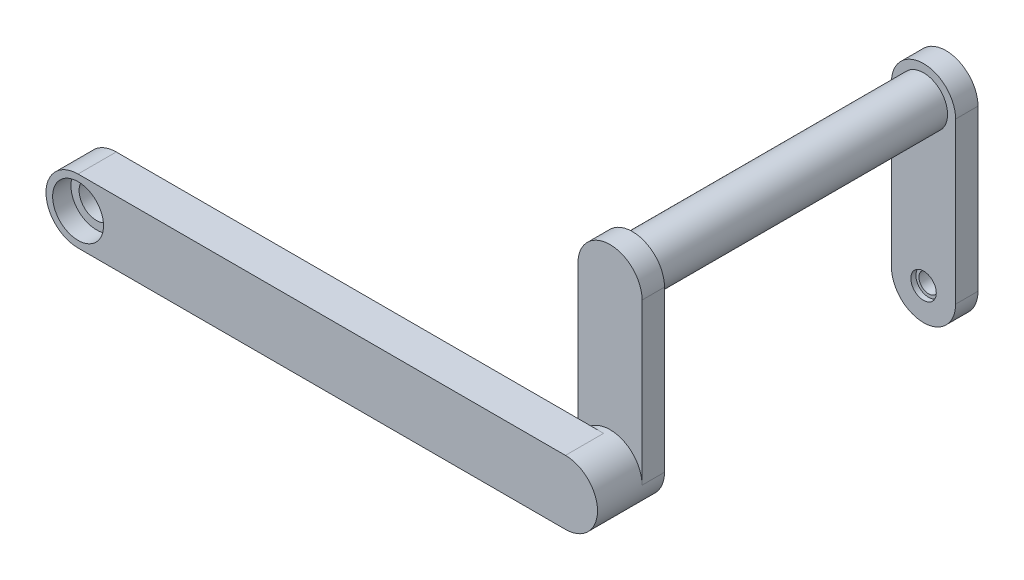
ISO-10303-21;
HEADER;
FILE_DESCRIPTION(('STEP AP214'),'2;1');
FILE_NAME('part.step','',(''),(''),'','','');
FILE_SCHEMA(('AUTOMOTIVE_DESIGN { 1 0 10303 214 1 1 1 1 }'));
ENDSEC;
DATA;
#1=APPLICATION_CONTEXT('core data for automotive mechanical design processes');
#2=APPLICATION_PROTOCOL_DEFINITION('international standard','automotive_design',2000,#1);
#3=PRODUCT_CONTEXT('',#1,'mechanical');
#4=PRODUCT('Part','Part','',(#3));
#5=PRODUCT_RELATED_PRODUCT_CATEGORY('part','',(#4));
#6=PRODUCT_DEFINITION_FORMATION('','',#4);
#7=PRODUCT_DEFINITION_CONTEXT('part definition',#1,'design');
#8=PRODUCT_DEFINITION('design','',#6,#7);
#9=PRODUCT_DEFINITION_SHAPE('','',#8);
#10=(LENGTH_UNIT() NAMED_UNIT(*) SI_UNIT(.MILLI.,.METRE.));
#11=(NAMED_UNIT(*) PLANE_ANGLE_UNIT() SI_UNIT($,.RADIAN.));
#12=(NAMED_UNIT(*) SI_UNIT($,.STERADIAN.) SOLID_ANGLE_UNIT());
#13=UNCERTAINTY_MEASURE_WITH_UNIT(LENGTH_MEASURE(1.E-05),#10,'distance_accuracy_value','');
#14=(GEOMETRIC_REPRESENTATION_CONTEXT(3) GLOBAL_UNCERTAINTY_ASSIGNED_CONTEXT((#13)) GLOBAL_UNIT_ASSIGNED_CONTEXT((#10,
#11,#12)) REPRESENTATION_CONTEXT('',''));
#15=CARTESIAN_POINT('',(0.,0.,0.));
#16=DIRECTION('',(0.,0.,1.));
#17=DIRECTION('',(1.,0.,0.));
#18=AXIS2_PLACEMENT_3D('',#15,#16,#17);
#19=CARTESIAN_POINT('',(47.88,0.,-33.63));
#20=DIRECTION('',(0.,0.,1.));
#21=DIRECTION('',(1.,0.,0.));
#22=AXIS2_PLACEMENT_3D('',#19,#20,#21);
#23=CYLINDRICAL_SURFACE('',#22,0.950000000000001);
#24=CARTESIAN_POINT('',(47.88,0.,-33.63));
#25=DIRECTION('',(0.,0.,-1.));
#26=DIRECTION('',(-1.,0.,0.));
#27=AXIS2_PLACEMENT_3D('',#24,#25,#26);
#28=CIRCLE('',#27,0.950000000000001);
#29=CARTESIAN_POINT('',(46.93,0.,-33.63));
#30=VERTEX_POINT('',#29);
#31=EDGE_CURVE('E462',#30,#30,#28,.T.);
#32=ORIENTED_EDGE('',*,*,#31,.T.);
#33=EDGE_LOOP('',(#32));
#34=FACE_BOUND('',#33,.T.);
#35=CARTESIAN_POINT('',(47.88,0.,-31.93));
#36=DIRECTION('',(0.,0.,1.));
#37=DIRECTION('',(1.,0.,0.));
#38=AXIS2_PLACEMENT_3D('',#35,#36,#37);
#39=CIRCLE('',#38,0.950000000000001);
#40=CARTESIAN_POINT('',(48.83,0.,-31.93));
#41=VERTEX_POINT('',#40);
#42=EDGE_CURVE('E45',#41,#41,#39,.T.);
#43=ORIENTED_EDGE('',*,*,#42,.T.);
#44=EDGE_LOOP('',(#43));
#45=FACE_BOUND('',#44,.T.);
#46=ADVANCED_FACE('F41',(#34,#45),#23,.F.);
#47=CARTESIAN_POINT('',(0.,0.,3.75));
#48=DIRECTION('',(0.,0.,-1.));
#49=DIRECTION('',(-1.,0.,0.));
#50=AXIS2_PLACEMENT_3D('',#47,#48,#49);
#51=CYLINDRICAL_SURFACE('',#50,1.7);
#52=CARTESIAN_POINT('',(0.,0.,0.));
#53=DIRECTION('',(0.,0.,1.));
#54=DIRECTION('',(1.,0.,0.));
#55=AXIS2_PLACEMENT_3D('',#52,#53,#54);
#56=CIRCLE('',#55,1.7);
#57=CARTESIAN_POINT('',(1.7,0.,0.));
#58=VERTEX_POINT('',#57);
#59=EDGE_CURVE('E213',#58,#58,#56,.T.);
#60=ORIENTED_EDGE('',*,*,#59,.F.);
#61=EDGE_LOOP('',(#60));
#62=FACE_BOUND('',#61,.T.);
#63=CARTESIAN_POINT('',(0.,0.,1.95));
#64=DIRECTION('',(0.,0.,1.));
#65=DIRECTION('',(1.,0.,0.));
#66=AXIS2_PLACEMENT_3D('',#63,#64,#65);
#67=CIRCLE('',#66,1.7);
#68=CARTESIAN_POINT('',(1.7,0.,1.95));
#69=VERTEX_POINT('',#68);
#70=EDGE_CURVE('E210',#69,#69,#67,.T.);
#71=ORIENTED_EDGE('',*,*,#70,.T.);
#72=EDGE_LOOP('',(#71));
#73=FACE_BOUND('',#72,.T.);
#74=ADVANCED_FACE('F240',(#62,#73),#51,.F.);
#75=CARTESIAN_POINT('',(0.,0.,3.75));
#76=DIRECTION('',(0.,0.,1.));
#77=DIRECTION('',(1.,0.,0.));
#78=AXIS2_PLACEMENT_3D('',#75,#76,#77);
#79=PLANE('',#78);
#80=CARTESIAN_POINT('',(0.,0.,3.75));
#81=DIRECTION('',(0.,0.,1.));
#82=DIRECTION('',(1.,0.,0.));
#83=AXIS2_PLACEMENT_3D('',#80,#81,#82);
#84=CIRCLE('',#83,2.5);
#85=CARTESIAN_POINT('',(2.5,0.,3.75));
#86=VERTEX_POINT('',#85);
#87=EDGE_CURVE('E206',#86,#86,#84,.T.);
#88=ORIENTED_EDGE('',*,*,#87,.F.);
#89=EDGE_LOOP('',(#88));
#90=FACE_BOUND('',#89,.T.);
#91=CARTESIAN_POINT('',(0.,0.,3.75));
#92=DIRECTION('',(0.,0.,1.));
#93=DIRECTION('',(1.,0.,0.));
#94=AXIS2_PLACEMENT_3D('',#91,#92,#93);
#95=CIRCLE('',#94,3.15);
#96=CARTESIAN_POINT('',(0.,3.15,3.75));
#97=VERTEX_POINT('',#96);
#98=CARTESIAN_POINT('',(0.,-3.15,3.75));
#99=VERTEX_POINT('',#98);
#100=EDGE_CURVE('E218',#97,#99,#95,.T.);
#101=ORIENTED_EDGE('',*,*,#100,.T.);
#102=DIRECTION('',(1.,0.,0.));
#103=VECTOR('',#102,1.);
#104=CARTESIAN_POINT('',(0.,-3.15,3.75));
#105=LINE('',#104,#103);
#106=CARTESIAN_POINT('',(47.88,-3.15,3.75));
#107=VERTEX_POINT('',#106);
#108=EDGE_CURVE('E93',#99,#107,#105,.T.);
#109=ORIENTED_EDGE('',*,*,#108,.T.);
#110=CARTESIAN_POINT('',(47.88,0.,3.75));
#111=DIRECTION('',(0.,0.,1.));
#112=DIRECTION('',(1.,0.,0.));
#113=AXIS2_PLACEMENT_3D('',#110,#111,#112);
#114=CIRCLE('',#113,3.15);
#115=CARTESIAN_POINT('',(47.88,3.15,3.75));
#116=VERTEX_POINT('',#115);
#117=EDGE_CURVE('E221',#107,#116,#114,.T.);
#118=ORIENTED_EDGE('',*,*,#117,.T.);
#119=DIRECTION('',(-1.,0.,0.));
#120=VECTOR('',#119,1.);
#121=CARTESIAN_POINT('',(0.,3.15,3.75));
#122=LINE('',#121,#120);
#123=EDGE_CURVE('E67',#116,#97,#122,.T.);
#124=ORIENTED_EDGE('',*,*,#123,.T.);
#125=EDGE_LOOP('',(#101,#109,#118,#124));
#126=FACE_BOUND('',#125,.T.);
#127=ADVANCED_FACE('F256',(#90,#126),#79,.T.);
#128=CARTESIAN_POINT('',(0.,0.,0.));
#129=DIRECTION('',(0.,0.,1.));
#130=DIRECTION('',(1.,0.,0.));
#131=AXIS2_PLACEMENT_3D('',#128,#129,#130);
#132=PLANE('',#131);
#133=CARTESIAN_POINT('',(47.88,0.,0.));
#134=DIRECTION('',(0.,0.,-1.));
#135=DIRECTION('',(-1.,0.,0.));
#136=AXIS2_PLACEMENT_3D('',#133,#134,#135);
#137=CIRCLE('',#136,3.15);
#138=CARTESIAN_POINT('',(47.88,-3.15,0.));
#139=VERTEX_POINT('',#138);
#140=CARTESIAN_POINT('',(47.88,3.15,0.));
#141=VERTEX_POINT('',#140);
#142=EDGE_CURVE('E11',#139,#141,#137,.T.);
#143=ORIENTED_EDGE('',*,*,#142,.F.);
#144=DIRECTION('',(1.,0.,0.));
#145=VECTOR('',#144,1.);
#146=CARTESIAN_POINT('',(0.,-3.15,0.));
#147=LINE('',#146,#145);
#148=CARTESIAN_POINT('',(0.,-3.15,0.));
#149=VERTEX_POINT('',#148);
#150=EDGE_CURVE('E227',#149,#139,#147,.T.);
#151=ORIENTED_EDGE('',*,*,#150,.F.);
#152=CARTESIAN_POINT('',(0.,0.,0.));
#153=DIRECTION('',(0.,0.,1.));
#154=DIRECTION('',(1.,0.,0.));
#155=AXIS2_PLACEMENT_3D('',#152,#153,#154);
#156=CIRCLE('',#155,3.15);
#157=CARTESIAN_POINT('',(0.,3.15,0.));
#158=VERTEX_POINT('',#157);
#159=EDGE_CURVE('E217',#158,#149,#156,.T.);
#160=ORIENTED_EDGE('',*,*,#159,.F.);
#161=DIRECTION('',(-1.,0.,0.));
#162=VECTOR('',#161,1.);
#163=CARTESIAN_POINT('',(0.,3.15,0.));
#164=LINE('',#163,#162);
#165=EDGE_CURVE('E85',#141,#158,#164,.T.);
#166=ORIENTED_EDGE('',*,*,#165,.F.);
#167=EDGE_LOOP('',(#143,#151,#160,#166));
#168=FACE_BOUND('',#167,.T.);
#169=ORIENTED_EDGE('',*,*,#59,.T.);
#170=EDGE_LOOP('',(#169));
#171=FACE_BOUND('',#170,.T.);
#172=ADVANCED_FACE('F258',(#168,#171),#132,.F.);
#173=CARTESIAN_POINT('',(0.,0.,3.75));
#174=DIRECTION('',(0.,0.,-1.));
#175=DIRECTION('',(-1.,0.,0.));
#176=AXIS2_PLACEMENT_3D('',#173,#174,#175);
#177=CYLINDRICAL_SURFACE('',#176,3.15);
#178=ORIENTED_EDGE('',*,*,#159,.T.);
#179=DIRECTION('',(0.,0.,-1.));
#180=VECTOR('',#179,1.);
#181=CARTESIAN_POINT('',(0.,-3.15,3.75));
#182=LINE('',#181,#180);
#183=EDGE_CURVE('E50',#99,#149,#182,.T.);
#184=ORIENTED_EDGE('',*,*,#183,.F.);
#185=ORIENTED_EDGE('',*,*,#100,.F.);
#186=DIRECTION('',(0.,0.,-1.));
#187=VECTOR('',#186,1.);
#188=CARTESIAN_POINT('',(0.,3.15,3.75));
#189=LINE('',#188,#187);
#190=EDGE_CURVE('E224',#97,#158,#189,.T.);
#191=ORIENTED_EDGE('',*,*,#190,.T.);
#192=EDGE_LOOP('',(#178,#184,#185,#191));
#193=FACE_BOUND('',#192,.T.);
#194=ADVANCED_FACE('F43',(#193),#177,.T.);
#195=CARTESIAN_POINT('',(0.,-3.15,3.75));
#196=DIRECTION('',(0.,1.,0.));
#197=DIRECTION('',(-1.,0.,0.));
#198=AXIS2_PLACEMENT_3D('',#195,#196,#197);
#199=PLANE('',#198);
#200=ORIENTED_EDGE('',*,*,#150,.T.);
#201=DIRECTION('',(0.,0.,-1.));
#202=VECTOR('',#201,1.);
#203=CARTESIAN_POINT('',(47.88,-3.15,3.75));
#204=LINE('',#203,#202);
#205=EDGE_CURVE('E234',#107,#139,#204,.T.);
#206=ORIENTED_EDGE('',*,*,#205,.F.);
#207=ORIENTED_EDGE('',*,*,#108,.F.);
#208=ORIENTED_EDGE('',*,*,#183,.T.);
#209=EDGE_LOOP('',(#200,#206,#207,#208));
#210=FACE_BOUND('',#209,.T.);
#211=ADVANCED_FACE('F264',(#210),#199,.F.);
#212=CARTESIAN_POINT('',(47.88,0.,3.75));
#213=DIRECTION('',(0.,0.,-1.));
#214=DIRECTION('',(-1.,0.,0.));
#215=AXIS2_PLACEMENT_3D('',#212,#213,#214);
#216=CYLINDRICAL_SURFACE('',#215,3.15);
#217=ORIENTED_EDGE('',*,*,#205,.T.);
#218=ORIENTED_EDGE('',*,*,#142,.T.);
#219=DIRECTION('',(0.,0.,-1.));
#220=VECTOR('',#219,1.);
#221=CARTESIAN_POINT('',(47.88,3.15,3.75));
#222=LINE('',#221,#220);
#223=EDGE_CURVE('E232',#116,#141,#222,.T.);
#224=ORIENTED_EDGE('',*,*,#223,.F.);
#225=ORIENTED_EDGE('',*,*,#117,.F.);
#226=EDGE_LOOP('',(#217,#218,#224,#225));
#227=FACE_BOUND('',#226,.T.);
#228=CARTESIAN_POINT('',(47.88,0.,-0.63));
#229=DIRECTION('',(0.,0.,-1.));
#230=DIRECTION('',(-1.,0.,0.));
#231=AXIS2_PLACEMENT_3D('',#228,#229,#230);
#232=CIRCLE('',#231,3.15);
#233=CARTESIAN_POINT('',(44.73,0.,-0.63));
#234=VERTEX_POINT('',#233);
#235=CARTESIAN_POINT('',(51.03,0.,-0.63));
#236=VERTEX_POINT('',#235);
#237=EDGE_CURVE('E58',#234,#236,#232,.T.);
#238=ORIENTED_EDGE('',*,*,#237,.F.);
#239=DIRECTION('',(0.,0.,1.));
#240=VECTOR('',#239,1.);
#241=CARTESIAN_POINT('',(44.73,0.,-2.83));
#242=LINE('',#241,#240);
#243=CARTESIAN_POINT('',(44.73,0.,-2.83));
#244=VERTEX_POINT('',#243);
#245=EDGE_CURVE('E197',#244,#234,#242,.T.);
#246=ORIENTED_EDGE('',*,*,#245,.F.);
#247=CARTESIAN_POINT('',(47.88,0.,-2.83));
#248=DIRECTION('',(0.,0.,-1.));
#249=DIRECTION('',(-1.,0.,0.));
#250=AXIS2_PLACEMENT_3D('',#247,#248,#249);
#251=CIRCLE('',#250,3.15);
#252=CARTESIAN_POINT('',(51.03,0.,-2.83));
#253=VERTEX_POINT('',#252);
#254=EDGE_CURVE('E185',#253,#244,#251,.T.);
#255=ORIENTED_EDGE('',*,*,#254,.F.);
#256=DIRECTION('',(0.,0.,1.));
#257=VECTOR('',#256,1.);
#258=CARTESIAN_POINT('',(51.03,0.,-2.83));
#259=LINE('',#258,#257);
#260=EDGE_CURVE('E200',#253,#236,#259,.T.);
#261=ORIENTED_EDGE('',*,*,#260,.T.);
#262=EDGE_LOOP('',(#238,#246,#255,#261));
#263=FACE_BOUND('',#262,.T.);
#264=ADVANCED_FACE('F268',(#227,#263),#216,.T.);
#265=CARTESIAN_POINT('',(0.,3.15,3.75));
#266=DIRECTION('',(0.,-1.,0.));
#267=DIRECTION('',(1.,0.,0.));
#268=AXIS2_PLACEMENT_3D('',#265,#266,#267);
#269=PLANE('',#268);
#270=ORIENTED_EDGE('',*,*,#165,.T.);
#271=ORIENTED_EDGE('',*,*,#190,.F.);
#272=ORIENTED_EDGE('',*,*,#123,.F.);
#273=ORIENTED_EDGE('',*,*,#223,.T.);
#274=EDGE_LOOP('',(#270,#271,#272,#273));
#275=FACE_BOUND('',#274,.T.);
#276=ADVANCED_FACE('F252',(#275),#269,.F.);
#277=CARTESIAN_POINT('',(0.,0.,1.95));
#278=DIRECTION('',(0.,0.,1.));
#279=DIRECTION('',(1.,0.,0.));
#280=AXIS2_PLACEMENT_3D('',#277,#278,#279);
#281=CYLINDRICAL_SURFACE('',#280,2.5);
#282=CARTESIAN_POINT('',(0.,0.,1.95));
#283=DIRECTION('',(0.,0.,1.));
#284=DIRECTION('',(1.,0.,0.));
#285=AXIS2_PLACEMENT_3D('',#282,#283,#284);
#286=CIRCLE('',#285,2.5);
#287=CARTESIAN_POINT('',(2.5,0.,1.95));
#288=VERTEX_POINT('',#287);
#289=EDGE_CURVE('E207',#288,#288,#286,.T.);
#290=ORIENTED_EDGE('',*,*,#289,.F.);
#291=EDGE_LOOP('',(#290));
#292=FACE_BOUND('',#291,.T.);
#293=ORIENTED_EDGE('',*,*,#87,.T.);
#294=EDGE_LOOP('',(#293));
#295=FACE_BOUND('',#294,.T.);
#296=ADVANCED_FACE('F246',(#292,#295),#281,.F.);
#297=CARTESIAN_POINT('',(0.,0.,1.95));
#298=DIRECTION('',(0.,0.,1.));
#299=DIRECTION('',(1.,0.,0.));
#300=AXIS2_PLACEMENT_3D('',#297,#298,#299);
#301=PLANE('',#300);
#302=ORIENTED_EDGE('',*,*,#70,.F.);
#303=EDGE_LOOP('',(#302));
#304=FACE_BOUND('',#303,.T.);
#305=ORIENTED_EDGE('',*,*,#289,.T.);
#306=EDGE_LOOP('',(#305));
#307=FACE_BOUND('',#306,.T.);
#308=ADVANCED_FACE('F242',(#304,#307),#301,.T.);
#309=CARTESIAN_POINT('',(47.88,15.75,-0.63));
#310=DIRECTION('',(0.,0.,-1.));
#311=DIRECTION('',(-1.,0.,0.));
#312=AXIS2_PLACEMENT_3D('',#309,#310,#311);
#313=PLANE('',#312);
#314=DIRECTION('',(0.,1.,0.));
#315=VECTOR('',#314,1.);
#316=CARTESIAN_POINT('',(44.73,15.75,-0.63));
#317=LINE('',#316,#315);
#318=CARTESIAN_POINT('',(44.73,15.75,-0.63));
#319=VERTEX_POINT('',#318);
#320=EDGE_CURVE('E183',#234,#319,#317,.T.);
#321=ORIENTED_EDGE('',*,*,#320,.F.);
#322=ORIENTED_EDGE('',*,*,#237,.T.);
#323=DIRECTION('',(0.,-1.,0.));
#324=VECTOR('',#323,1.);
#325=CARTESIAN_POINT('',(51.03,15.75,-0.63));
#326=LINE('',#325,#324);
#327=CARTESIAN_POINT('',(51.03,15.75,-0.63));
#328=VERTEX_POINT('',#327);
#329=EDGE_CURVE('E192',#328,#236,#326,.T.);
#330=ORIENTED_EDGE('',*,*,#329,.F.);
#331=CARTESIAN_POINT('',(47.88,15.75,-0.63));
#332=DIRECTION('',(0.,0.,-1.));
#333=DIRECTION('',(-1.,0.,0.));
#334=AXIS2_PLACEMENT_3D('',#331,#332,#333);
#335=CIRCLE('',#334,3.15);
#336=EDGE_CURVE('E177',#319,#328,#335,.T.);
#337=ORIENTED_EDGE('',*,*,#336,.F.);
#338=EDGE_LOOP('',(#321,#322,#330,#337));
#339=FACE_BOUND('',#338,.T.);
#340=ADVANCED_FACE('F245',(#339),#313,.F.);
#341=CARTESIAN_POINT('',(47.88,15.75,-2.83));
#342=DIRECTION('',(0.,0.,1.));
#343=DIRECTION('',(1.,0.,0.));
#344=AXIS2_PLACEMENT_3D('',#341,#342,#343);
#345=CYLINDRICAL_SURFACE('',#344,3.15);
#346=ORIENTED_EDGE('',*,*,#336,.T.);
#347=DIRECTION('',(0.,0.,1.));
#348=VECTOR('',#347,1.);
#349=CARTESIAN_POINT('',(51.03,15.75,-2.83));
#350=LINE('',#349,#348);
#351=CARTESIAN_POINT('',(51.03,15.75,-2.83));
#352=VERTEX_POINT('',#351);
#353=EDGE_CURVE('E203',#352,#328,#350,.T.);
#354=ORIENTED_EDGE('',*,*,#353,.F.);
#355=CARTESIAN_POINT('',(47.88,15.75,-2.83));
#356=DIRECTION('',(0.,0.,-1.));
#357=DIRECTION('',(-1.,0.,0.));
#358=AXIS2_PLACEMENT_3D('',#355,#356,#357);
#359=CIRCLE('',#358,3.15);
#360=CARTESIAN_POINT('',(44.73,15.75,-2.83));
#361=VERTEX_POINT('',#360);
#362=EDGE_CURVE('E179',#361,#352,#359,.T.);
#363=ORIENTED_EDGE('',*,*,#362,.F.);
#364=DIRECTION('',(0.,0.,1.));
#365=VECTOR('',#364,1.);
#366=CARTESIAN_POINT('',(44.73,15.75,-2.83));
#367=LINE('',#366,#365);
#368=EDGE_CURVE('E189',#361,#319,#367,.T.);
#369=ORIENTED_EDGE('',*,*,#368,.T.);
#370=EDGE_LOOP('',(#346,#354,#363,#369));
#371=FACE_BOUND('',#370,.T.);
#372=ADVANCED_FACE('F334',(#371),#345,.T.);
#373=CARTESIAN_POINT('',(51.03,15.75,-2.83));
#374=DIRECTION('',(-1.,0.,0.));
#375=DIRECTION('',(0.,0.,1.));
#376=AXIS2_PLACEMENT_3D('',#373,#374,#375);
#377=PLANE('',#376);
#378=ORIENTED_EDGE('',*,*,#329,.T.);
#379=ORIENTED_EDGE('',*,*,#260,.F.);
#380=DIRECTION('',(0.,-1.,0.));
#381=VECTOR('',#380,1.);
#382=CARTESIAN_POINT('',(51.03,15.75,-2.83));
#383=LINE('',#382,#381);
#384=EDGE_CURVE('E182',#352,#253,#383,.T.);
#385=ORIENTED_EDGE('',*,*,#384,.F.);
#386=ORIENTED_EDGE('',*,*,#353,.T.);
#387=EDGE_LOOP('',(#378,#379,#385,#386));
#388=FACE_BOUND('',#387,.T.);
#389=ADVANCED_FACE('F342',(#388),#377,.F.);
#390=CARTESIAN_POINT('',(44.73,15.75,-2.83));
#391=DIRECTION('',(1.,0.,0.));
#392=DIRECTION('',(0.,0.,-1.));
#393=AXIS2_PLACEMENT_3D('',#390,#391,#392);
#394=PLANE('',#393);
#395=ORIENTED_EDGE('',*,*,#320,.T.);
#396=ORIENTED_EDGE('',*,*,#368,.F.);
#397=DIRECTION('',(0.,1.,0.));
#398=VECTOR('',#397,1.);
#399=CARTESIAN_POINT('',(44.73,15.75,-2.83));
#400=LINE('',#399,#398);
#401=EDGE_CURVE('E187',#244,#361,#400,.T.);
#402=ORIENTED_EDGE('',*,*,#401,.F.);
#403=ORIENTED_EDGE('',*,*,#245,.T.);
#404=EDGE_LOOP('',(#395,#396,#402,#403));
#405=FACE_BOUND('',#404,.T.);
#406=ADVANCED_FACE('F351',(#405),#394,.F.);
#407=CARTESIAN_POINT('',(47.88,15.75,-2.83));
#408=DIRECTION('',(0.,0.,-1.));
#409=DIRECTION('',(-1.,0.,0.));
#410=AXIS2_PLACEMENT_3D('',#407,#408,#409);
#411=PLANE('',#410);
#412=CARTESIAN_POINT('',(47.88,15.75,-2.83));
#413=DIRECTION('',(0.,0.,-1.));
#414=DIRECTION('',(-1.,0.,0.));
#415=AXIS2_PLACEMENT_3D('',#412,#413,#414);
#416=CIRCLE('',#415,2.3625);
#417=CARTESIAN_POINT('',(45.5175,15.75,-2.83));
#418=VERTEX_POINT('',#417);
#419=EDGE_CURVE('E167',#418,#418,#416,.T.);
#420=ORIENTED_EDGE('',*,*,#419,.F.);
#421=EDGE_LOOP('',(#420));
#422=FACE_BOUND('',#421,.T.);
#423=ORIENTED_EDGE('',*,*,#362,.T.);
#424=ORIENTED_EDGE('',*,*,#384,.T.);
#425=ORIENTED_EDGE('',*,*,#254,.T.);
#426=ORIENTED_EDGE('',*,*,#401,.T.);
#427=EDGE_LOOP('',(#423,#424,#425,#426));
#428=FACE_BOUND('',#427,.T.);
#429=ADVANCED_FACE('F360',(#422,#428),#411,.T.);
#430=CARTESIAN_POINT('',(47.88,15.75,-31.43));
#431=DIRECTION('',(0.,0.,1.));
#432=DIRECTION('',(1.,0.,0.));
#433=AXIS2_PLACEMENT_3D('',#430,#431,#432);
#434=CYLINDRICAL_SURFACE('',#433,2.3625);
#435=CARTESIAN_POINT('',(47.88,15.75,-31.43));
#436=DIRECTION('',(0.,0.,-1.));
#437=DIRECTION('',(-1.,0.,0.));
#438=AXIS2_PLACEMENT_3D('',#435,#436,#437);
#439=CIRCLE('',#438,2.3625);
#440=CARTESIAN_POINT('',(45.5175,15.75,-31.43));
#441=VERTEX_POINT('',#440);
#442=EDGE_CURVE('E170',#441,#441,#439,.T.);
#443=ORIENTED_EDGE('',*,*,#442,.F.);
#444=EDGE_LOOP('',(#443));
#445=FACE_BOUND('',#444,.T.);
#446=ORIENTED_EDGE('',*,*,#419,.T.);
#447=EDGE_LOOP('',(#446));
#448=FACE_BOUND('',#447,.T.);
#449=ADVANCED_FACE('F369',(#445,#448),#434,.T.);
#450=CARTESIAN_POINT('',(47.88,15.75,-33.63));
#451=DIRECTION('',(0.,0.,-1.));
#452=DIRECTION('',(-1.,0.,0.));
#453=AXIS2_PLACEMENT_3D('',#450,#451,#452);
#454=PLANE('',#453);
#455=CARTESIAN_POINT('',(47.88,15.75,-33.63));
#456=DIRECTION('',(0.,0.,-1.));
#457=DIRECTION('',(-1.,0.,0.));
#458=AXIS2_PLACEMENT_3D('',#455,#456,#457);
#459=CIRCLE('',#458,3.15);
#460=CARTESIAN_POINT('',(44.73,15.75,-33.63));
#461=VERTEX_POINT('',#460);
#462=CARTESIAN_POINT('',(51.03,15.75,-33.63));
#463=VERTEX_POINT('',#462);
#464=EDGE_CURVE('E152',#461,#463,#459,.T.);
#465=ORIENTED_EDGE('',*,*,#464,.T.);
#466=DIRECTION('',(0.,-1.,0.));
#467=VECTOR('',#466,1.);
#468=CARTESIAN_POINT('',(51.03,15.75,-33.63));
#469=LINE('',#468,#467);
#470=CARTESIAN_POINT('',(51.03,0.,-33.63));
#471=VERTEX_POINT('',#470);
#472=EDGE_CURVE('E141',#463,#471,#469,.T.);
#473=ORIENTED_EDGE('',*,*,#472,.T.);
#474=CARTESIAN_POINT('',(47.88,0.,-33.63));
#475=DIRECTION('',(0.,0.,-1.));
#476=DIRECTION('',(-1.,0.,0.));
#477=AXIS2_PLACEMENT_3D('',#474,#475,#476);
#478=CIRCLE('',#477,3.15);
#479=CARTESIAN_POINT('',(44.73,0.,-33.63));
#480=VERTEX_POINT('',#479);
#481=EDGE_CURVE('E151',#471,#480,#478,.T.);
#482=ORIENTED_EDGE('',*,*,#481,.T.);
#483=DIRECTION('',(0.,1.,0.));
#484=VECTOR('',#483,1.);
#485=CARTESIAN_POINT('',(44.73,15.75,-33.63));
#486=LINE('',#485,#484);
#487=EDGE_CURVE('E158',#480,#461,#486,.T.);
#488=ORIENTED_EDGE('',*,*,#487,.T.);
#489=EDGE_LOOP('',(#465,#473,#482,#488));
#490=FACE_BOUND('',#489,.T.);
#491=ORIENTED_EDGE('',*,*,#31,.F.);
#492=EDGE_LOOP('',(#491));
#493=FACE_BOUND('',#492,.T.);
#494=ADVANCED_FACE('F155',(#490,#493),#454,.T.);
#495=CARTESIAN_POINT('',(47.88,15.75,-31.43));
#496=DIRECTION('',(0.,0.,-1.));
#497=DIRECTION('',(-1.,0.,0.));
#498=AXIS2_PLACEMENT_3D('',#495,#496,#497);
#499=PLANE('',#498);
#500=CARTESIAN_POINT('',(47.88,0.,-31.43));
#501=DIRECTION('',(0.,0.,1.));
#502=DIRECTION('',(1.,0.,0.));
#503=AXIS2_PLACEMENT_3D('',#500,#501,#502);
#504=CIRCLE('',#503,1.25);
#505=CARTESIAN_POINT('',(49.13,0.,-31.43));
#506=VERTEX_POINT('',#505);
#507=EDGE_CURVE('E460',#506,#506,#504,.T.);
#508=ORIENTED_EDGE('',*,*,#507,.F.);
#509=EDGE_LOOP('',(#508));
#510=FACE_BOUND('',#509,.T.);
#511=ORIENTED_EDGE('',*,*,#442,.T.);
#512=EDGE_LOOP('',(#511));
#513=FACE_BOUND('',#512,.T.);
#514=CARTESIAN_POINT('',(47.88,15.75,-31.43));
#515=DIRECTION('',(0.,0.,-1.));
#516=DIRECTION('',(-1.,0.,0.));
#517=AXIS2_PLACEMENT_3D('',#514,#515,#516);
#518=CIRCLE('',#517,3.15);
#519=CARTESIAN_POINT('',(44.73,15.75,-31.43));
#520=VERTEX_POINT('',#519);
#521=CARTESIAN_POINT('',(51.03,15.75,-31.43));
#522=VERTEX_POINT('',#521);
#523=EDGE_CURVE('E166',#520,#522,#518,.T.);
#524=ORIENTED_EDGE('',*,*,#523,.F.);
#525=DIRECTION('',(0.,1.,0.));
#526=VECTOR('',#525,1.);
#527=CARTESIAN_POINT('',(44.73,15.75,-31.43));
#528=LINE('',#527,#526);
#529=CARTESIAN_POINT('',(44.73,0.,-31.43));
#530=VERTEX_POINT('',#529);
#531=EDGE_CURVE('E162',#530,#520,#528,.T.);
#532=ORIENTED_EDGE('',*,*,#531,.F.);
#533=CARTESIAN_POINT('',(47.88,0.,-31.43));
#534=DIRECTION('',(0.,0.,-1.));
#535=DIRECTION('',(-1.,0.,0.));
#536=AXIS2_PLACEMENT_3D('',#533,#534,#535);
#537=CIRCLE('',#536,3.15);
#538=CARTESIAN_POINT('',(51.03,0.,-31.43));
#539=VERTEX_POINT('',#538);
#540=EDGE_CURVE('E474',#539,#530,#537,.T.);
#541=ORIENTED_EDGE('',*,*,#540,.F.);
#542=DIRECTION('',(0.,-1.,0.));
#543=VECTOR('',#542,1.);
#544=CARTESIAN_POINT('',(51.03,15.75,-31.43));
#545=LINE('',#544,#543);
#546=EDGE_CURVE('E472',#522,#539,#545,.T.);
#547=ORIENTED_EDGE('',*,*,#546,.F.);
#548=EDGE_LOOP('',(#524,#532,#541,#547));
#549=FACE_BOUND('',#548,.T.);
#550=ADVANCED_FACE('F386',(#510,#513,#549),#499,.F.);
#551=CARTESIAN_POINT('',(47.88,15.75,-33.63));
#552=DIRECTION('',(0.,0.,1.));
#553=DIRECTION('',(1.,0.,0.));
#554=AXIS2_PLACEMENT_3D('',#551,#552,#553);
#555=CYLINDRICAL_SURFACE('',#554,3.15);
#556=ORIENTED_EDGE('',*,*,#523,.T.);
#557=DIRECTION('',(0.,0.,1.));
#558=VECTOR('',#557,1.);
#559=CARTESIAN_POINT('',(51.03,15.75,-33.63));
#560=LINE('',#559,#558);
#561=EDGE_CURVE('E145',#463,#522,#560,.T.);
#562=ORIENTED_EDGE('',*,*,#561,.F.);
#563=ORIENTED_EDGE('',*,*,#464,.F.);
#564=DIRECTION('',(0.,0.,1.));
#565=VECTOR('',#564,1.);
#566=CARTESIAN_POINT('',(44.73,15.75,-33.63));
#567=LINE('',#566,#565);
#568=EDGE_CURVE('E470',#461,#520,#567,.T.);
#569=ORIENTED_EDGE('',*,*,#568,.T.);
#570=EDGE_LOOP('',(#556,#562,#563,#569));
#571=FACE_BOUND('',#570,.T.);
#572=ADVANCED_FACE('F164',(#571),#555,.T.);
#573=CARTESIAN_POINT('',(51.03,15.75,-33.63));
#574=DIRECTION('',(-1.,0.,0.));
#575=DIRECTION('',(0.,0.,1.));
#576=AXIS2_PLACEMENT_3D('',#573,#574,#575);
#577=PLANE('',#576);
#578=ORIENTED_EDGE('',*,*,#546,.T.);
#579=DIRECTION('',(0.,0.,1.));
#580=VECTOR('',#579,1.);
#581=CARTESIAN_POINT('',(51.03,0.,-33.63));
#582=LINE('',#581,#580);
#583=EDGE_CURVE('E148',#471,#539,#582,.T.);
#584=ORIENTED_EDGE('',*,*,#583,.F.);
#585=ORIENTED_EDGE('',*,*,#472,.F.);
#586=ORIENTED_EDGE('',*,*,#561,.T.);
#587=EDGE_LOOP('',(#578,#584,#585,#586));
#588=FACE_BOUND('',#587,.T.);
#589=ADVANCED_FACE('F143',(#588),#577,.F.);
#590=CARTESIAN_POINT('',(47.88,0.,-33.63));
#591=DIRECTION('',(0.,0.,1.));
#592=DIRECTION('',(1.,0.,0.));
#593=AXIS2_PLACEMENT_3D('',#590,#591,#592);
#594=CYLINDRICAL_SURFACE('',#593,3.15);
#595=ORIENTED_EDGE('',*,*,#540,.T.);
#596=DIRECTION('',(0.,0.,1.));
#597=VECTOR('',#596,1.);
#598=CARTESIAN_POINT('',(44.73,0.,-33.63));
#599=LINE('',#598,#597);
#600=EDGE_CURVE('E172',#480,#530,#599,.T.);
#601=ORIENTED_EDGE('',*,*,#600,.F.);
#602=ORIENTED_EDGE('',*,*,#481,.F.);
#603=ORIENTED_EDGE('',*,*,#583,.T.);
#604=EDGE_LOOP('',(#595,#601,#602,#603));
#605=FACE_BOUND('',#604,.T.);
#606=ADVANCED_FACE('F402',(#605),#594,.T.);
#607=CARTESIAN_POINT('',(44.73,15.75,-33.63));
#608=DIRECTION('',(1.,0.,0.));
#609=DIRECTION('',(0.,0.,-1.));
#610=AXIS2_PLACEMENT_3D('',#607,#608,#609);
#611=PLANE('',#610);
#612=ORIENTED_EDGE('',*,*,#531,.T.);
#613=ORIENTED_EDGE('',*,*,#568,.F.);
#614=ORIENTED_EDGE('',*,*,#487,.F.);
#615=ORIENTED_EDGE('',*,*,#600,.T.);
#616=EDGE_LOOP('',(#612,#613,#614,#615));
#617=FACE_BOUND('',#616,.T.);
#618=ADVANCED_FACE('F410',(#617),#611,.F.);
#619=CARTESIAN_POINT('',(47.88,0.,-31.93));
#620=DIRECTION('',(0.,0.,1.));
#621=DIRECTION('',(1.,0.,0.));
#622=AXIS2_PLACEMENT_3D('',#619,#620,#621);
#623=CYLINDRICAL_SURFACE('',#622,1.25);
#624=CARTESIAN_POINT('',(47.88,0.,-31.93));
#625=DIRECTION('',(0.,0.,1.));
#626=DIRECTION('',(1.,0.,0.));
#627=AXIS2_PLACEMENT_3D('',#624,#625,#626);
#628=CIRCLE('',#627,1.25);
#629=CARTESIAN_POINT('',(49.13,0.,-31.93));
#630=VERTEX_POINT('',#629);
#631=EDGE_CURVE('E459',#630,#630,#628,.T.);
#632=ORIENTED_EDGE('',*,*,#631,.F.);
#633=EDGE_LOOP('',(#632));
#634=FACE_BOUND('',#633,.T.);
#635=ORIENTED_EDGE('',*,*,#507,.T.);
#636=EDGE_LOOP('',(#635));
#637=FACE_BOUND('',#636,.T.);
#638=ADVANCED_FACE('F418',(#634,#637),#623,.F.);
#639=CARTESIAN_POINT('',(47.88,0.,-31.93));
#640=DIRECTION('',(0.,0.,1.));
#641=DIRECTION('',(1.,0.,0.));
#642=AXIS2_PLACEMENT_3D('',#639,#640,#641);
#643=PLANE('',#642);
#644=ORIENTED_EDGE('',*,*,#42,.F.);
#645=EDGE_LOOP('',(#644));
#646=FACE_BOUND('',#645,.T.);
#647=ORIENTED_EDGE('',*,*,#631,.T.);
#648=EDGE_LOOP('',(#647));
#649=FACE_BOUND('',#648,.T.);
#650=ADVANCED_FACE('F440',(#646,#649),#643,.T.);
#651=CLOSED_SHELL('',(#46,#74,#127,#172,#194,#211,#264,#276,#296,#308,#340,#372,#389,#406,#429,
#449,#494,#550,#572,#589,#606,#618,#638,#650));
#652=MANIFOLD_SOLID_BREP('B2',#651);
#653=ADVANCED_BREP_SHAPE_REPRESENTATION('',(#18,#652),#14);
#654=SHAPE_DEFINITION_REPRESENTATION(#9,#653);
ENDSEC;
END-ISO-10303-21;
